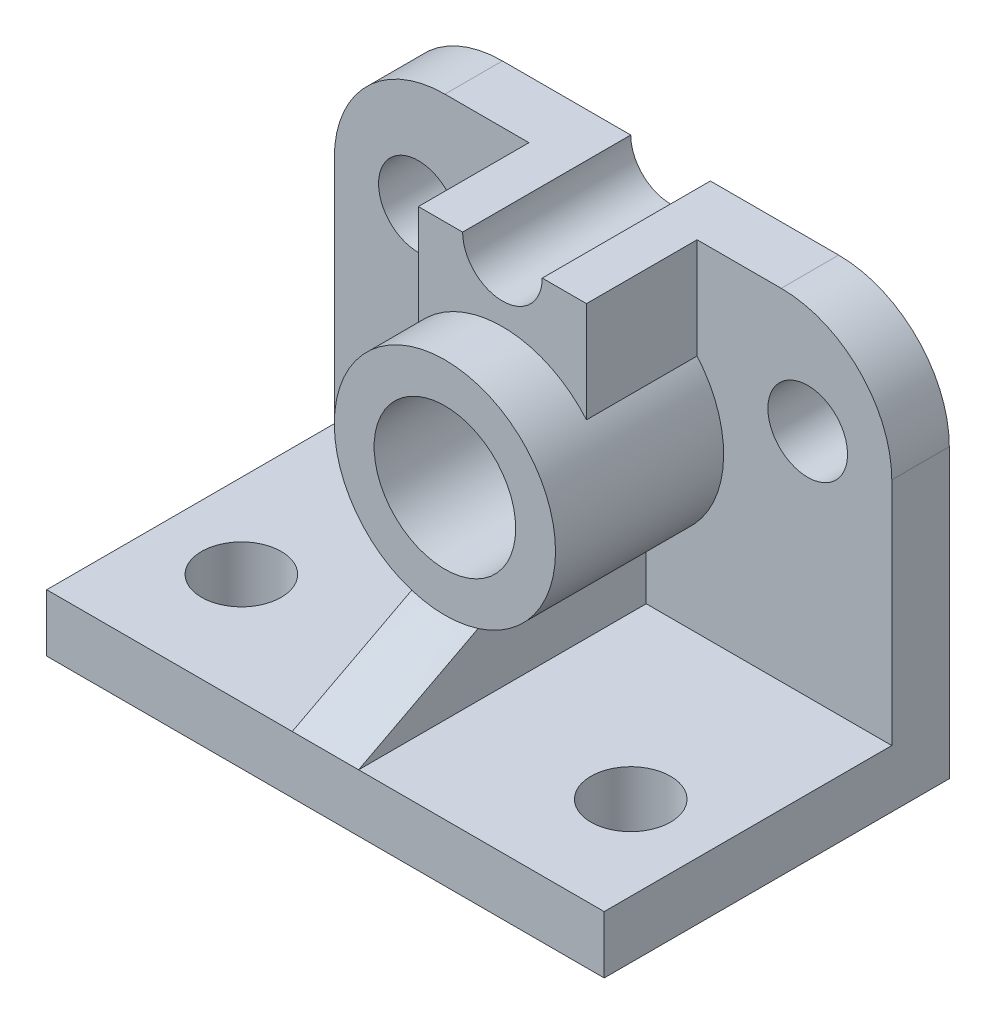
ISO-10303-21;
HEADER;
FILE_DESCRIPTION(('STEP AP214'),'2;1');
FILE_NAME('part.step','',(''),(''),'','','');
FILE_SCHEMA(('AUTOMOTIVE_DESIGN { 1 0 10303 214 1 1 1 1 }'));
ENDSEC;
DATA;
#1=APPLICATION_CONTEXT('core data for automotive mechanical design processes');
#2=APPLICATION_PROTOCOL_DEFINITION('international standard','automotive_design',2000,#1);
#3=PRODUCT_CONTEXT('',#1,'mechanical');
#4=PRODUCT('Part','Part','',(#3));
#5=PRODUCT_RELATED_PRODUCT_CATEGORY('part','',(#4));
#6=PRODUCT_DEFINITION_FORMATION('','',#4);
#7=PRODUCT_DEFINITION_CONTEXT('part definition',#1,'design');
#8=PRODUCT_DEFINITION('design','',#6,#7);
#9=PRODUCT_DEFINITION_SHAPE('','',#8);
#10=(LENGTH_UNIT() NAMED_UNIT(*) SI_UNIT(.MILLI.,.METRE.));
#11=(NAMED_UNIT(*) PLANE_ANGLE_UNIT() SI_UNIT($,.RADIAN.));
#12=(NAMED_UNIT(*) SI_UNIT($,.STERADIAN.) SOLID_ANGLE_UNIT());
#13=UNCERTAINTY_MEASURE_WITH_UNIT(LENGTH_MEASURE(1.E-05),#10,'distance_accuracy_value','');
#14=(GEOMETRIC_REPRESENTATION_CONTEXT(3) GLOBAL_UNCERTAINTY_ASSIGNED_CONTEXT((#13)) GLOBAL_UNIT_ASSIGNED_CONTEXT((#10,
#11,#12)) REPRESENTATION_CONTEXT('',''));
#15=CARTESIAN_POINT('',(0.,0.,0.));
#16=DIRECTION('',(0.,0.,1.));
#17=DIRECTION('',(1.,0.,0.));
#18=AXIS2_PLACEMENT_3D('',#15,#16,#17);
#19=CARTESIAN_POINT('',(0.,6.5,78.));
#20=DIRECTION('',(0.,1.,0.));
#21=DIRECTION('',(0.,0.,1.));
#22=AXIS2_PLACEMENT_3D('',#19,#20,#21);
#23=PLANE('',#22);
#24=CARTESIAN_POINT('',(-44.,6.5,53.));
#25=DIRECTION('',(0.,1.,0.));
#26=DIRECTION('',(0.,0.,1.));
#27=AXIS2_PLACEMENT_3D('',#24,#25,#26);
#28=CIRCLE('',#27,9.);
#29=CARTESIAN_POINT('',(-44.,6.5,62.));
#30=VERTEX_POINT('',#29);
#31=EDGE_CURVE('E309',#30,#30,#28,.T.);
#32=ORIENTED_EDGE('',*,*,#31,.F.);
#33=EDGE_LOOP('',(#32));
#34=FACE_BOUND('',#33,.T.);
#35=DIRECTION('',(1.,0.,0.));
#36=VECTOR('',#35,1.);
#37=CARTESIAN_POINT('',(0.,6.5,78.));
#38=LINE('',#37,#36);
#39=CARTESIAN_POINT('',(-63.,6.5,78.));
#40=VERTEX_POINT('',#39);
#41=CARTESIAN_POINT('',(-7.5,6.5,78.));
#42=VERTEX_POINT('',#41);
#43=EDGE_CURVE('E414',#40,#42,#38,.T.);
#44=ORIENTED_EDGE('',*,*,#43,.T.);
#45=DIRECTION('',(0.,0.,-1.));
#46=VECTOR('',#45,1.);
#47=CARTESIAN_POINT('',(-7.5,6.5,13.));
#48=LINE('',#47,#46);
#49=CARTESIAN_POINT('',(-7.5,6.5,13.));
#50=VERTEX_POINT('',#49);
#51=EDGE_CURVE('E211',#42,#50,#48,.T.);
#52=ORIENTED_EDGE('',*,*,#51,.T.);
#53=DIRECTION('',(1.,0.,0.));
#54=VECTOR('',#53,1.);
#55=CARTESIAN_POINT('',(0.,6.5,13.));
#56=LINE('',#55,#54);
#57=CARTESIAN_POINT('',(-63.,6.5,13.));
#58=VERTEX_POINT('',#57);
#59=EDGE_CURVE('E371',#58,#50,#56,.T.);
#60=ORIENTED_EDGE('',*,*,#59,.F.);
#61=DIRECTION('',(0.,0.,-1.));
#62=VECTOR('',#61,1.);
#63=CARTESIAN_POINT('',(-63.,6.5,78.));
#64=LINE('',#63,#62);
#65=EDGE_CURVE('E429',#40,#58,#64,.T.);
#66=ORIENTED_EDGE('',*,*,#65,.F.);
#67=EDGE_LOOP('',(#44,#52,#60,#66));
#68=FACE_BOUND('',#67,.T.);
#69=ADVANCED_FACE('F47',(#34,#68),#23,.T.);
#70=CARTESIAN_POINT('',(0.,0.,13.));
#71=DIRECTION('',(0.,0.,1.));
#72=DIRECTION('',(1.,0.,0.));
#73=AXIS2_PLACEMENT_3D('',#70,#71,#72);
#74=PLANE('',#73);
#75=CARTESIAN_POINT('',(-44.,58.5,13.));
#76=DIRECTION('',(0.,0.,1.));
#77=DIRECTION('',(1.,0.,0.));
#78=AXIS2_PLACEMENT_3D('',#75,#76,#77);
#79=CIRCLE('',#78,9.);
#80=CARTESIAN_POINT('',(-53.,58.5,13.));
#81=VERTEX_POINT('',#80);
#82=EDGE_CURVE('E386',#81,#81,#79,.T.);
#83=ORIENTED_EDGE('',*,*,#82,.F.);
#84=EDGE_LOOP('',(#83));
#85=FACE_BOUND('',#84,.T.);
#86=ORIENTED_EDGE('',*,*,#59,.T.);
#87=DIRECTION('',(0.,1.,0.));
#88=VECTOR('',#87,1.);
#89=CARTESIAN_POINT('',(-7.5,20.6515199645764,13.));
#90=LINE('',#89,#88);
#91=CARTESIAN_POINT('',(-7.5,20.6515199645764,13.));
#92=VERTEX_POINT('',#91);
#93=EDGE_CURVE('E199',#50,#92,#90,.T.);
#94=ORIENTED_EDGE('',*,*,#93,.T.);
#95=CARTESIAN_POINT('',(0.,44.5,13.));
#96=DIRECTION('',(0.,0.,1.));
#97=DIRECTION('',(1.,0.,0.));
#98=AXIS2_PLACEMENT_3D('',#95,#96,#97);
#99=CIRCLE('',#98,25.);
#100=CARTESIAN_POINT('',(-19.,60.7480768092719,13.));
#101=VERTEX_POINT('',#100);
#102=EDGE_CURVE('E195',#101,#92,#99,.T.);
#103=ORIENTED_EDGE('',*,*,#102,.F.);
#104=DIRECTION('',(0.,-1.,0.));
#105=VECTOR('',#104,1.);
#106=CARTESIAN_POINT('',(-19.,0.,13.));
#107=LINE('',#106,#105);
#108=CARTESIAN_POINT('',(-19.,83.5,13.));
#109=VERTEX_POINT('',#108);
#110=EDGE_CURVE('E360',#109,#101,#107,.T.);
#111=ORIENTED_EDGE('',*,*,#110,.F.);
#112=DIRECTION('',(1.,0.,0.));
#113=VECTOR('',#112,1.);
#114=CARTESIAN_POINT('',(0.,83.5,13.));
#115=LINE('',#114,#113);
#116=CARTESIAN_POINT('',(-38.,83.5,13.));
#117=VERTEX_POINT('',#116);
#118=EDGE_CURVE('E502',#117,#109,#115,.T.);
#119=ORIENTED_EDGE('',*,*,#118,.F.);
#120=CARTESIAN_POINT('',(-38.,58.5,13.));
#121=DIRECTION('',(0.,0.,1.));
#122=DIRECTION('',(1.,0.,0.));
#123=AXIS2_PLACEMENT_3D('',#120,#121,#122);
#124=CIRCLE('',#123,25.);
#125=CARTESIAN_POINT('',(-63.,58.5,13.));
#126=VERTEX_POINT('',#125);
#127=EDGE_CURVE('E460',#117,#126,#124,.T.);
#128=ORIENTED_EDGE('',*,*,#127,.T.);
#129=DIRECTION('',(0.,1.,0.));
#130=VECTOR('',#129,1.);
#131=CARTESIAN_POINT('',(-63.,0.,13.));
#132=LINE('',#131,#130);
#133=EDGE_CURVE('E372',#58,#126,#132,.T.);
#134=ORIENTED_EDGE('',*,*,#133,.F.);
#135=EDGE_LOOP('',(#86,#94,#103,#111,#119,#128,#134));
#136=FACE_BOUND('',#135,.T.);
#137=ADVANCED_FACE('F515',(#85,#136),#74,.T.);
#138=CARTESIAN_POINT('',(0.,44.5,51.));
#139=DIRECTION('',(0.,0.,-1.));
#140=DIRECTION('',(-1.,0.,0.));
#141=AXIS2_PLACEMENT_3D('',#138,#139,#140);
#142=CYLINDRICAL_SURFACE('',#141,25.);
#143=ORIENTED_EDGE('',*,*,#102,.T.);
#144=DIRECTION('',(0.,0.,1.));
#145=VECTOR('',#144,1.);
#146=CARTESIAN_POINT('',(-7.5,20.6515199645764,51.));
#147=LINE('',#146,#145);
#148=CARTESIAN_POINT('',(-7.5,20.6515199645764,51.));
#149=VERTEX_POINT('',#148);
#150=EDGE_CURVE('E192',#92,#149,#147,.T.);
#151=ORIENTED_EDGE('',*,*,#150,.T.);
#152=CARTESIAN_POINT('',(0.,44.5,51.));
#153=DIRECTION('',(0.,0.,1.));
#154=DIRECTION('',(1.,0.,0.));
#155=AXIS2_PLACEMENT_3D('',#152,#153,#154);
#156=CIRCLE('',#155,25.);
#157=CARTESIAN_POINT('',(7.5,20.6515199645764,51.));
#158=VERTEX_POINT('',#157);
#159=EDGE_CURVE('E177',#158,#149,#156,.T.);
#160=ORIENTED_EDGE('',*,*,#159,.F.);
#161=DIRECTION('',(0.,0.,1.));
#162=VECTOR('',#161,1.);
#163=CARTESIAN_POINT('',(7.5,20.6515199645764,51.));
#164=LINE('',#163,#162);
#165=CARTESIAN_POINT('',(7.5,20.6515199645764,13.));
#166=VERTEX_POINT('',#165);
#167=EDGE_CURVE('E275',#166,#158,#164,.T.);
#168=ORIENTED_EDGE('',*,*,#167,.F.);
#169=CARTESIAN_POINT('',(19.,60.7480768092719,13.));
#170=VERTEX_POINT('',#169);
#171=EDGE_CURVE('E364',#166,#170,#99,.T.);
#172=ORIENTED_EDGE('',*,*,#171,.T.);
#173=DIRECTION('',(0.,0.,-1.));
#174=VECTOR('',#173,1.);
#175=CARTESIAN_POINT('',(19.,60.7480768092719,38.));
#176=LINE('',#175,#174);
#177=CARTESIAN_POINT('',(19.,60.7480768092719,38.));
#178=VERTEX_POINT('',#177);
#179=EDGE_CURVE('E342',#178,#170,#176,.T.);
#180=ORIENTED_EDGE('',*,*,#179,.F.);
#181=CARTESIAN_POINT('',(0.,44.5,38.));
#182=DIRECTION('',(0.,0.,1.));
#183=DIRECTION('',(1.,0.,0.));
#184=AXIS2_PLACEMENT_3D('',#181,#182,#183);
#185=CIRCLE('',#184,25.);
#186=CARTESIAN_POINT('',(-19.,60.7480768092719,38.));
#187=VERTEX_POINT('',#186);
#188=EDGE_CURVE('E326',#178,#187,#185,.T.);
#189=ORIENTED_EDGE('',*,*,#188,.T.);
#190=DIRECTION('',(0.,0.,-1.));
#191=VECTOR('',#190,1.);
#192=CARTESIAN_POINT('',(-19.,60.7480768092719,38.));
#193=LINE('',#192,#191);
#194=EDGE_CURVE('E345',#187,#101,#193,.T.);
#195=ORIENTED_EDGE('',*,*,#194,.T.);
#196=EDGE_LOOP('',(#143,#151,#160,#168,#172,#180,#189,#195));
#197=FACE_BOUND('',#196,.T.);
#198=ADVANCED_FACE('F193',(#197),#142,.T.);
#199=CARTESIAN_POINT('',(63.,0.,78.));
#200=DIRECTION('',(1.,0.,0.));
#201=DIRECTION('',(0.,0.,-1.));
#202=AXIS2_PLACEMENT_3D('',#199,#200,#201);
#203=PLANE('',#202);
#204=DIRECTION('',(0.,-1.,0.));
#205=VECTOR('',#204,1.);
#206=CARTESIAN_POINT('',(63.,0.,0.));
#207=LINE('',#206,#205);
#208=CARTESIAN_POINT('',(63.,58.5,0.));
#209=VERTEX_POINT('',#208);
#210=CARTESIAN_POINT('',(63.,-6.5,0.));
#211=VERTEX_POINT('',#210);
#212=EDGE_CURVE('E392',#209,#211,#207,.T.);
#213=ORIENTED_EDGE('',*,*,#212,.F.);
#214=DIRECTION('',(0.,0.,-1.));
#215=VECTOR('',#214,1.);
#216=CARTESIAN_POINT('',(63.,58.5,78.));
#217=LINE('',#216,#215);
#218=CARTESIAN_POINT('',(63.,58.5,13.));
#219=VERTEX_POINT('',#218);
#220=EDGE_CURVE('E57',#209,#219,#217,.F.);
#221=ORIENTED_EDGE('',*,*,#220,.T.);
#222=DIRECTION('',(0.,1.,0.));
#223=VECTOR('',#222,1.);
#224=CARTESIAN_POINT('',(63.,0.,13.));
#225=LINE('',#224,#223);
#226=CARTESIAN_POINT('',(63.,6.5,13.));
#227=VERTEX_POINT('',#226);
#228=EDGE_CURVE('E376',#227,#219,#225,.T.);
#229=ORIENTED_EDGE('',*,*,#228,.F.);
#230=DIRECTION('',(0.,0.,-1.));
#231=VECTOR('',#230,1.);
#232=CARTESIAN_POINT('',(63.,6.5,78.));
#233=LINE('',#232,#231);
#234=CARTESIAN_POINT('',(63.,6.5,78.));
#235=VERTEX_POINT('',#234);
#236=EDGE_CURVE('E421',#235,#227,#233,.T.);
#237=ORIENTED_EDGE('',*,*,#236,.F.);
#238=DIRECTION('',(0.,-1.,0.));
#239=VECTOR('',#238,1.);
#240=CARTESIAN_POINT('',(63.,0.,78.));
#241=LINE('',#240,#239);
#242=CARTESIAN_POINT('',(63.,-6.5,78.));
#243=VERTEX_POINT('',#242);
#244=EDGE_CURVE('E403',#235,#243,#241,.T.);
#245=ORIENTED_EDGE('',*,*,#244,.T.);
#246=DIRECTION('',(0.,0.,-1.));
#247=VECTOR('',#246,1.);
#248=CARTESIAN_POINT('',(63.,-6.5,78.));
#249=LINE('',#248,#247);
#250=EDGE_CURVE('E438',#243,#211,#249,.T.);
#251=ORIENTED_EDGE('',*,*,#250,.T.);
#252=EDGE_LOOP('',(#213,#221,#229,#237,#245,#251));
#253=FACE_BOUND('',#252,.T.);
#254=ADVANCED_FACE('F426',(#253),#203,.T.);
#255=DIRECTION('',(0.,0.,-1.));
#256=VECTOR('',#255,1.);
#257=CARTESIAN_POINT('',(7.5,6.5,13.));
#258=LINE('',#257,#256);
#259=CARTESIAN_POINT('',(7.5,6.5,78.));
#260=VERTEX_POINT('',#259);
#261=CARTESIAN_POINT('',(7.5,6.5,13.));
#262=VERTEX_POINT('',#261);
#263=EDGE_CURVE('E64',#260,#262,#258,.T.);
#264=ORIENTED_EDGE('',*,*,#263,.F.);
#265=EDGE_CURVE('E406',#260,#235,#38,.T.);
#266=ORIENTED_EDGE('',*,*,#265,.T.);
#267=ORIENTED_EDGE('',*,*,#236,.T.);
#268=EDGE_CURVE('E368',#262,#227,#56,.T.);
#269=ORIENTED_EDGE('',*,*,#268,.F.);
#270=EDGE_LOOP('',(#264,#266,#267,#269));
#271=FACE_BOUND('',#270,.T.);
#272=CARTESIAN_POINT('',(44.,6.5,53.));
#273=DIRECTION('',(0.,1.,0.));
#274=DIRECTION('',(0.,0.,-1.));
#275=AXIS2_PLACEMENT_3D('',#272,#273,#274);
#276=CIRCLE('',#275,9.);
#277=CARTESIAN_POINT('',(44.,6.5,44.));
#278=VERTEX_POINT('',#277);
#279=EDGE_CURVE('E274',#278,#278,#276,.T.);
#280=ORIENTED_EDGE('',*,*,#279,.F.);
#281=EDGE_LOOP('',(#280));
#282=FACE_BOUND('',#281,.T.);
#283=ADVANCED_FACE('F419',(#271,#282),#23,.T.);
#284=CARTESIAN_POINT('',(-63.,0.,78.));
#285=DIRECTION('',(1.,0.,0.));
#286=DIRECTION('',(0.,0.,-1.));
#287=AXIS2_PLACEMENT_3D('',#284,#285,#286);
#288=PLANE('',#287);
#289=ORIENTED_EDGE('',*,*,#133,.T.);
#290=DIRECTION('',(0.,0.,-1.));
#291=VECTOR('',#290,1.);
#292=CARTESIAN_POINT('',(-63.,58.5,0.));
#293=LINE('',#292,#291);
#294=CARTESIAN_POINT('',(-63.,58.5,0.));
#295=VERTEX_POINT('',#294);
#296=EDGE_CURVE('E428',#126,#295,#293,.T.);
#297=ORIENTED_EDGE('',*,*,#296,.T.);
#298=DIRECTION('',(0.,-1.,0.));
#299=VECTOR('',#298,1.);
#300=CARTESIAN_POINT('',(-63.,0.,0.));
#301=LINE('',#300,#299);
#302=CARTESIAN_POINT('',(-63.,-6.5,0.));
#303=VERTEX_POINT('',#302);
#304=EDGE_CURVE('E513',#295,#303,#301,.T.);
#305=ORIENTED_EDGE('',*,*,#304,.T.);
#306=DIRECTION('',(0.,0.,-1.));
#307=VECTOR('',#306,1.);
#308=CARTESIAN_POINT('',(-63.,-6.5,78.));
#309=LINE('',#308,#307);
#310=CARTESIAN_POINT('',(-63.,-6.5,78.));
#311=VERTEX_POINT('',#310);
#312=EDGE_CURVE('E442',#311,#303,#309,.T.);
#313=ORIENTED_EDGE('',*,*,#312,.F.);
#314=DIRECTION('',(0.,-1.,0.));
#315=VECTOR('',#314,1.);
#316=CARTESIAN_POINT('',(-63.,0.,78.));
#317=LINE('',#316,#315);
#318=EDGE_CURVE('E410',#40,#311,#317,.T.);
#319=ORIENTED_EDGE('',*,*,#318,.F.);
#320=ORIENTED_EDGE('',*,*,#65,.T.);
#321=EDGE_LOOP('',(#289,#297,#305,#313,#319,#320));
#322=FACE_BOUND('',#321,.T.);
#323=ADVANCED_FACE('F508',(#322),#288,.F.);
#324=CARTESIAN_POINT('',(0.,-6.5,78.));
#325=DIRECTION('',(0.,1.,0.));
#326=DIRECTION('',(0.,0.,1.));
#327=AXIS2_PLACEMENT_3D('',#324,#325,#326);
#328=PLANE('',#327);
#329=CARTESIAN_POINT('',(-44.,-6.5,53.));
#330=DIRECTION('',(0.,1.,0.));
#331=DIRECTION('',(0.,0.,1.));
#332=AXIS2_PLACEMENT_3D('',#329,#330,#331);
#333=CIRCLE('',#332,9.);
#334=CARTESIAN_POINT('',(-44.,-6.5,62.));
#335=VERTEX_POINT('',#334);
#336=EDGE_CURVE('E300',#335,#335,#333,.T.);
#337=ORIENTED_EDGE('',*,*,#336,.T.);
#338=EDGE_LOOP('',(#337));
#339=FACE_BOUND('',#338,.T.);
#340=CARTESIAN_POINT('',(44.,-6.5,53.));
#341=DIRECTION('',(0.,1.,0.));
#342=DIRECTION('',(0.,0.,-1.));
#343=AXIS2_PLACEMENT_3D('',#340,#341,#342);
#344=CIRCLE('',#343,9.);
#345=CARTESIAN_POINT('',(44.,-6.5,44.));
#346=VERTEX_POINT('',#345);
#347=EDGE_CURVE('E312',#346,#346,#344,.T.);
#348=ORIENTED_EDGE('',*,*,#347,.T.);
#349=EDGE_LOOP('',(#348));
#350=FACE_BOUND('',#349,.T.);
#351=DIRECTION('',(1.,0.,0.));
#352=VECTOR('',#351,1.);
#353=CARTESIAN_POINT('',(0.,-6.5,0.));
#354=LINE('',#353,#352);
#355=EDGE_CURVE('E407',#303,#211,#354,.T.);
#356=ORIENTED_EDGE('',*,*,#355,.T.);
#357=ORIENTED_EDGE('',*,*,#250,.F.);
#358=DIRECTION('',(1.,0.,0.));
#359=VECTOR('',#358,1.);
#360=CARTESIAN_POINT('',(0.,-6.5,78.));
#361=LINE('',#360,#359);
#362=EDGE_CURVE('E416',#311,#243,#361,.T.);
#363=ORIENTED_EDGE('',*,*,#362,.F.);
#364=ORIENTED_EDGE('',*,*,#312,.T.);
#365=EDGE_LOOP('',(#356,#357,#363,#364));
#366=FACE_BOUND('',#365,.T.);
#367=ADVANCED_FACE('F440',(#339,#350,#366),#328,.F.);
#368=CARTESIAN_POINT('',(0.,0.,78.));
#369=DIRECTION('',(0.,0.,1.));
#370=DIRECTION('',(1.,0.,0.));
#371=AXIS2_PLACEMENT_3D('',#368,#369,#370);
#372=PLANE('',#371);
#373=ORIENTED_EDGE('',*,*,#244,.F.);
#374=ORIENTED_EDGE('',*,*,#265,.F.);
#375=DIRECTION('',(-1.,0.,0.));
#376=VECTOR('',#375,1.);
#377=CARTESIAN_POINT('',(0.,6.5,78.));
#378=LINE('',#377,#376);
#379=EDGE_CURVE('E71',#260,#42,#378,.T.);
#380=ORIENTED_EDGE('',*,*,#379,.T.);
#381=ORIENTED_EDGE('',*,*,#43,.F.);
#382=ORIENTED_EDGE('',*,*,#318,.T.);
#383=ORIENTED_EDGE('',*,*,#362,.T.);
#384=EDGE_LOOP('',(#373,#374,#380,#381,#382,#383));
#385=FACE_BOUND('',#384,.T.);
#386=ADVANCED_FACE('F431',(#385),#372,.T.);
#387=CARTESIAN_POINT('',(0.,0.,0.));
#388=DIRECTION('',(0.,0.,1.));
#389=DIRECTION('',(1.,0.,0.));
#390=AXIS2_PLACEMENT_3D('',#387,#388,#389);
#391=PLANE('',#390);
#392=ORIENTED_EDGE('',*,*,#304,.F.);
#393=CARTESIAN_POINT('',(-38.,58.5,0.));
#394=DIRECTION('',(0.,0.,1.));
#395=DIRECTION('',(1.,0.,0.));
#396=AXIS2_PLACEMENT_3D('',#393,#394,#395);
#397=CIRCLE('',#396,25.);
#398=CARTESIAN_POINT('',(-38.,83.5,0.));
#399=VERTEX_POINT('',#398);
#400=EDGE_CURVE('E454',#295,#399,#397,.F.);
#401=ORIENTED_EDGE('',*,*,#400,.T.);
#402=DIRECTION('',(1.,0.,0.));
#403=VECTOR('',#402,1.);
#404=CARTESIAN_POINT('',(0.,83.5,0.));
#405=LINE('',#404,#403);
#406=CARTESIAN_POINT('',(-9.,83.5,0.));
#407=VERTEX_POINT('',#406);
#408=EDGE_CURVE('E187',#399,#407,#405,.T.);
#409=ORIENTED_EDGE('',*,*,#408,.T.);
#410=CARTESIAN_POINT('',(0.,83.5,0.));
#411=DIRECTION('',(0.,0.,1.));
#412=DIRECTION('',(1.,0.,0.));
#413=AXIS2_PLACEMENT_3D('',#410,#411,#412);
#414=CIRCLE('',#413,9.);
#415=CARTESIAN_POINT('',(9.,83.5,0.));
#416=VERTEX_POINT('',#415);
#417=EDGE_CURVE('E308',#407,#416,#414,.T.);
#418=ORIENTED_EDGE('',*,*,#417,.T.);
#419=DIRECTION('',(1.,0.,0.));
#420=VECTOR('',#419,1.);
#421=CARTESIAN_POINT('',(0.,83.5,0.));
#422=LINE('',#421,#420);
#423=CARTESIAN_POINT('',(38.,83.5,0.));
#424=VERTEX_POINT('',#423);
#425=EDGE_CURVE('E394',#416,#424,#422,.T.);
#426=ORIENTED_EDGE('',*,*,#425,.T.);
#427=CARTESIAN_POINT('',(38.,58.5,0.));
#428=DIRECTION('',(0.,0.,1.));
#429=DIRECTION('',(1.,0.,0.));
#430=AXIS2_PLACEMENT_3D('',#427,#428,#429);
#431=CIRCLE('',#430,25.);
#432=EDGE_CURVE('E452',#424,#209,#431,.F.);
#433=ORIENTED_EDGE('',*,*,#432,.T.);
#434=ORIENTED_EDGE('',*,*,#212,.T.);
#435=ORIENTED_EDGE('',*,*,#355,.F.);
#436=EDGE_LOOP('',(#392,#401,#409,#418,#426,#433,#434,#435));
#437=FACE_BOUND('',#436,.T.);
#438=CARTESIAN_POINT('',(-44.,58.5,0.));
#439=DIRECTION('',(0.,0.,1.));
#440=DIRECTION('',(1.,0.,0.));
#441=AXIS2_PLACEMENT_3D('',#438,#439,#440);
#442=CIRCLE('',#441,9.);
#443=CARTESIAN_POINT('',(-53.,58.5,0.));
#444=VERTEX_POINT('',#443);
#445=EDGE_CURVE('E397',#444,#444,#442,.T.);
#446=ORIENTED_EDGE('',*,*,#445,.T.);
#447=EDGE_LOOP('',(#446));
#448=FACE_BOUND('',#447,.T.);
#449=CARTESIAN_POINT('',(44.,58.4999999999999,0.));
#450=DIRECTION('',(0.,0.,1.));
#451=DIRECTION('',(1.,0.,0.));
#452=AXIS2_PLACEMENT_3D('',#449,#450,#451);
#453=CIRCLE('',#452,9.);
#454=CARTESIAN_POINT('',(35.,58.4999999999999,0.));
#455=VERTEX_POINT('',#454);
#456=EDGE_CURVE('E400',#455,#455,#453,.F.);
#457=ORIENTED_EDGE('',*,*,#456,.F.);
#458=EDGE_LOOP('',(#457));
#459=FACE_BOUND('',#458,.T.);
#460=CARTESIAN_POINT('',(0.,44.5,0.));
#461=DIRECTION('',(0.,0.,1.));
#462=DIRECTION('',(1.,0.,0.));
#463=AXIS2_PLACEMENT_3D('',#460,#461,#462);
#464=CIRCLE('',#463,16.);
#465=CARTESIAN_POINT('',(16.,44.5,0.));
#466=VERTEX_POINT('',#465);
#467=EDGE_CURVE('E353',#466,#466,#464,.T.);
#468=ORIENTED_EDGE('',*,*,#467,.T.);
#469=EDGE_LOOP('',(#468));
#470=FACE_BOUND('',#469,.T.);
#471=ADVANCED_FACE('F478',(#437,#448,#459,#470),#391,.F.);
#472=CARTESIAN_POINT('',(0.,83.5,13.));
#473=DIRECTION('',(0.,1.,0.));
#474=DIRECTION('',(0.,0.,1.));
#475=AXIS2_PLACEMENT_3D('',#472,#473,#474);
#476=PLANE('',#475);
#477=ORIENTED_EDGE('',*,*,#408,.F.);
#478=DIRECTION('',(0.,0.,-1.));
#479=VECTOR('',#478,1.);
#480=CARTESIAN_POINT('',(-38.,83.5,13.));
#481=LINE('',#480,#479);
#482=EDGE_CURVE('E456',#399,#117,#481,.F.);
#483=ORIENTED_EDGE('',*,*,#482,.T.);
#484=ORIENTED_EDGE('',*,*,#118,.T.);
#485=DIRECTION('',(0.,0.,-1.));
#486=VECTOR('',#485,1.);
#487=CARTESIAN_POINT('',(-19.,83.5,38.));
#488=LINE('',#487,#486);
#489=CARTESIAN_POINT('',(-19.,83.5,38.));
#490=VERTEX_POINT('',#489);
#491=EDGE_CURVE('E347',#490,#109,#488,.T.);
#492=ORIENTED_EDGE('',*,*,#491,.F.);
#493=DIRECTION('',(1.,0.,0.));
#494=VECTOR('',#493,1.);
#495=CARTESIAN_POINT('',(0.,83.5,38.));
#496=LINE('',#495,#494);
#497=CARTESIAN_POINT('',(-9.,83.5,38.));
#498=VERTEX_POINT('',#497);
#499=EDGE_CURVE('E320',#490,#498,#496,.T.);
#500=ORIENTED_EDGE('',*,*,#499,.T.);
#501=DIRECTION('',(0.,0.,-1.));
#502=VECTOR('',#501,1.);
#503=CARTESIAN_POINT('',(-9.,83.5,38.));
#504=LINE('',#503,#502);
#505=EDGE_CURVE('E350',#498,#407,#504,.T.);
#506=ORIENTED_EDGE('',*,*,#505,.T.);
#507=EDGE_LOOP('',(#477,#483,#484,#492,#500,#506));
#508=FACE_BOUND('',#507,.T.);
#509=ADVANCED_FACE('F514',(#508),#476,.T.);
#510=CARTESIAN_POINT('',(0.,83.5,13.));
#511=DIRECTION('',(0.,1.,0.));
#512=DIRECTION('',(0.,0.,1.));
#513=AXIS2_PLACEMENT_3D('',#510,#511,#512);
#514=PLANE('',#513);
#515=DIRECTION('',(1.,0.,0.));
#516=VECTOR('',#515,1.);
#517=CARTESIAN_POINT('',(0.,83.5,13.));
#518=LINE('',#517,#516);
#519=CARTESIAN_POINT('',(19.,83.4999999999999,13.));
#520=VERTEX_POINT('',#519);
#521=CARTESIAN_POINT('',(38.,83.5,13.));
#522=VERTEX_POINT('',#521);
#523=EDGE_CURVE('E380',#520,#522,#518,.T.);
#524=ORIENTED_EDGE('',*,*,#523,.T.);
#525=DIRECTION('',(0.,0.,-1.));
#526=VECTOR('',#525,1.);
#527=CARTESIAN_POINT('',(38.,83.5,13.));
#528=LINE('',#527,#526);
#529=EDGE_CURVE('E462',#522,#424,#528,.T.);
#530=ORIENTED_EDGE('',*,*,#529,.T.);
#531=ORIENTED_EDGE('',*,*,#425,.F.);
#532=DIRECTION('',(0.,0.,-1.));
#533=VECTOR('',#532,1.);
#534=CARTESIAN_POINT('',(9.,83.5,38.));
#535=LINE('',#534,#533);
#536=CARTESIAN_POINT('',(9.,83.5,38.));
#537=VERTEX_POINT('',#536);
#538=EDGE_CURVE('E334',#537,#416,#535,.T.);
#539=ORIENTED_EDGE('',*,*,#538,.F.);
#540=DIRECTION('',(1.,0.,0.));
#541=VECTOR('',#540,1.);
#542=CARTESIAN_POINT('',(4.63518112781003E-13,83.5,38.));
#543=LINE('',#542,#541);
#544=CARTESIAN_POINT('',(19.,83.4999999999999,38.));
#545=VERTEX_POINT('',#544);
#546=EDGE_CURVE('E331',#537,#545,#543,.T.);
#547=ORIENTED_EDGE('',*,*,#546,.T.);
#548=DIRECTION('',(0.,0.,-1.));
#549=VECTOR('',#548,1.);
#550=CARTESIAN_POINT('',(19.,83.4999999999999,38.));
#551=LINE('',#550,#549);
#552=EDGE_CURVE('E339',#545,#520,#551,.T.);
#553=ORIENTED_EDGE('',*,*,#552,.T.);
#554=EDGE_LOOP('',(#524,#530,#531,#539,#547,#553));
#555=FACE_BOUND('',#554,.T.);
#556=ADVANCED_FACE('F475',(#555),#514,.T.);
#557=CARTESIAN_POINT('',(-44.,58.5,13.));
#558=DIRECTION('',(0.,0.,-1.));
#559=DIRECTION('',(-1.,0.,0.));
#560=AXIS2_PLACEMENT_3D('',#557,#558,#559);
#561=CYLINDRICAL_SURFACE('',#560,9.);
#562=CARTESIAN_POINT('',(-53.,58.5,13.));
#563=CARTESIAN_POINT('',(-53.,58.5,12.8645833333333));
#564=CARTESIAN_POINT('',(-53.,58.5,12.7291666666667));
#565=CARTESIAN_POINT('',(-53.,58.5,12.4583333333333));
#566=CARTESIAN_POINT('',(-53.,58.5,12.3229166666667));
#567=CARTESIAN_POINT('',(-53.,58.5,12.0520833333333));
#568=CARTESIAN_POINT('',(-53.,58.5,11.9166666666667));
#569=CARTESIAN_POINT('',(-53.,58.5,11.6458333333333));
#570=CARTESIAN_POINT('',(-53.,58.5,11.5104166666667));
#571=CARTESIAN_POINT('',(-53.,58.5,11.2395833333333));
#572=CARTESIAN_POINT('',(-53.,58.5,11.1041666666667));
#573=CARTESIAN_POINT('',(-53.,58.5,10.8333333333333));
#574=CARTESIAN_POINT('',(-53.,58.5,10.6979166666667));
#575=CARTESIAN_POINT('',(-53.,58.5,10.4270833333333));
#576=CARTESIAN_POINT('',(-53.,58.5,10.2916666666667));
#577=CARTESIAN_POINT('',(-53.,58.5,10.0208333333333));
#578=CARTESIAN_POINT('',(-53.,58.5,9.88541666666667));
#579=CARTESIAN_POINT('',(-53.,58.5,9.61458333333333));
#580=CARTESIAN_POINT('',(-53.,58.5,9.47916666666667));
#581=CARTESIAN_POINT('',(-53.,58.5,9.20833333333333));
#582=CARTESIAN_POINT('',(-53.,58.5,9.07291666666666));
#583=CARTESIAN_POINT('',(-53.,58.5,8.80208333333333));
#584=CARTESIAN_POINT('',(-53.,58.5,8.66666666666667));
#585=CARTESIAN_POINT('',(-53.,58.5,8.39583333333333));
#586=CARTESIAN_POINT('',(-53.,58.5,8.26041666666667));
#587=CARTESIAN_POINT('',(-53.,58.5,7.98958333333333));
#588=CARTESIAN_POINT('',(-53.,58.5,7.85416666666667));
#589=CARTESIAN_POINT('',(-53.,58.5,7.58333333333333));
#590=CARTESIAN_POINT('',(-53.,58.5,7.44791666666667));
#591=CARTESIAN_POINT('',(-53.,58.5,7.17708333333333));
#592=CARTESIAN_POINT('',(-53.,58.5,7.04166666666667));
#593=CARTESIAN_POINT('',(-53.,58.5,6.77083333333333));
#594=CARTESIAN_POINT('',(-53.,58.5,6.63541666666667));
#595=CARTESIAN_POINT('',(-53.,58.5,6.36458333333333));
#596=CARTESIAN_POINT('',(-53.,58.5,6.22916666666667));
#597=CARTESIAN_POINT('',(-53.,58.5,5.95833333333333));
#598=CARTESIAN_POINT('',(-53.,58.5,5.82291666666667));
#599=CARTESIAN_POINT('',(-53.,58.5,5.55208333333333));
#600=CARTESIAN_POINT('',(-53.,58.5,5.41666666666667));
#601=CARTESIAN_POINT('',(-53.,58.5,5.14583333333333));
#602=CARTESIAN_POINT('',(-53.,58.5,5.01041666666667));
#603=CARTESIAN_POINT('',(-53.,58.5,4.73958333333333));
#604=CARTESIAN_POINT('',(-53.,58.5,4.60416666666667));
#605=CARTESIAN_POINT('',(-53.,58.5,4.33333333333333));
#606=CARTESIAN_POINT('',(-53.,58.5,4.19791666666667));
#607=CARTESIAN_POINT('',(-53.,58.5,3.92708333333333));
#608=CARTESIAN_POINT('',(-53.,58.5,3.79166666666667));
#609=CARTESIAN_POINT('',(-53.,58.5,3.52083333333333));
#610=CARTESIAN_POINT('',(-53.,58.5,3.38541666666667));
#611=CARTESIAN_POINT('',(-53.,58.5,3.11458333333333));
#612=CARTESIAN_POINT('',(-53.,58.5,2.97916666666667));
#613=CARTESIAN_POINT('',(-53.,58.5,2.70833333333333));
#614=CARTESIAN_POINT('',(-53.,58.5,2.57291666666667));
#615=CARTESIAN_POINT('',(-53.,58.5,2.30208333333333));
#616=CARTESIAN_POINT('',(-53.,58.5,2.16666666666667));
#617=CARTESIAN_POINT('',(-53.,58.5,1.89583333333333));
#618=CARTESIAN_POINT('',(-53.,58.5,1.76041666666667));
#619=CARTESIAN_POINT('',(-53.,58.5,1.48958333333333));
#620=CARTESIAN_POINT('',(-53.,58.5,1.35416666666667));
#621=CARTESIAN_POINT('',(-53.,58.5,1.08333333333333));
#622=CARTESIAN_POINT('',(-53.,58.5,0.947916666666667));
#623=CARTESIAN_POINT('',(-53.,58.5,0.677083333333334));
#624=CARTESIAN_POINT('',(-53.,58.5,0.541666666666667));
#625=CARTESIAN_POINT('',(-53.,58.5,0.270833333333334));
#626=CARTESIAN_POINT('',(-53.,58.5,0.135416666666667));
#627=CARTESIAN_POINT('',(-53.,58.5,0.));
#628=B_SPLINE_CURVE_WITH_KNOTS('',3,(#562,#563,#564,#565,#566,#567,#568,#569,#570,#571,#572,
#573,#574,#575,#576,#577,#578,#579,#580,#581,#582,#583,#584,#585,#586,#587,#588,#589,#590,#591,
#592,#593,#594,#595,#596,#597,#598,#599,#600,#601,#602,#603,#604,#605,#606,#607,#608,#609,#610,
#611,#612,#613,#614,#615,#616,#617,#618,#619,#620,#621,#622,#623,#624,#625,#626,#627),
.UNSPECIFIED.,.F.,.F.,(4,2,2,2,2,2,2,2,2,2,2,2,2,2,2,2,2,2,2,2,2,2,2,2,2,2,2,2,2,2,2,2,4),(0.,
0.40625,0.812500000000001,1.21875,1.625,2.03125,2.4375,2.84375,3.25,3.65625,4.0625,4.46875,
4.875,5.28125,5.6875,6.09375,6.5,6.90625,7.3125,7.71875,8.125,8.53125,8.9375,9.34375,9.75,
10.15625,10.5625,10.96875,11.375,11.78125,12.1875,12.59375,13.),.UNSPECIFIED.);
#629=EDGE_CURVE('BSEAM537',#81,#444,#628,.T.);
#630=ORIENTED_EDGE('',*,*,#82,.T.);
#631=ORIENTED_EDGE('',*,*,#445,.F.);
#632=ORIENTED_EDGE('',*,*,#629,.T.);
#633=ORIENTED_EDGE('',*,*,#629,.F.);
#634=EDGE_LOOP('',(#630,#632,#631,#633));
#635=FACE_BOUND('',#634,.T.);
#636=ADVANCED_FACE('F537',(#635),#561,.F.);
#637=CARTESIAN_POINT('',(44.,58.4999999999999,13.));
#638=DIRECTION('',(0.,0.,-1.));
#639=DIRECTION('',(-1.,0.,0.));
#640=AXIS2_PLACEMENT_3D('',#637,#638,#639);
#641=CYLINDRICAL_SURFACE('',#640,9.);
#642=CARTESIAN_POINT('',(44.,58.4999999999999,13.));
#643=DIRECTION('',(0.,0.,1.));
#644=DIRECTION('',(1.,0.,0.));
#645=AXIS2_PLACEMENT_3D('',#642,#643,#644);
#646=CIRCLE('',#645,9.);
#647=CARTESIAN_POINT('',(35.,58.4999999999999,13.));
#648=VERTEX_POINT('',#647);
#649=EDGE_CURVE('E389',#648,#648,#646,.F.);
#650=CARTESIAN_POINT('',(35.,58.4999999999999,13.));
#651=CARTESIAN_POINT('',(35.,58.4999999999999,12.8645833333333));
#652=CARTESIAN_POINT('',(35.,58.4999999999999,12.7291666666667));
#653=CARTESIAN_POINT('',(35.,58.4999999999999,12.4583333333333));
#654=CARTESIAN_POINT('',(35.,58.4999999999999,12.3229166666667));
#655=CARTESIAN_POINT('',(35.,58.4999999999999,12.0520833333333));
#656=CARTESIAN_POINT('',(35.,58.4999999999999,11.9166666666667));
#657=CARTESIAN_POINT('',(35.,58.4999999999999,11.6458333333333));
#658=CARTESIAN_POINT('',(35.,58.4999999999999,11.5104166666667));
#659=CARTESIAN_POINT('',(35.,58.4999999999999,11.2395833333333));
#660=CARTESIAN_POINT('',(35.,58.4999999999999,11.1041666666667));
#661=CARTESIAN_POINT('',(35.,58.4999999999999,10.8333333333333));
#662=CARTESIAN_POINT('',(35.,58.4999999999999,10.6979166666667));
#663=CARTESIAN_POINT('',(35.,58.4999999999999,10.4270833333333));
#664=CARTESIAN_POINT('',(35.,58.4999999999999,10.2916666666667));
#665=CARTESIAN_POINT('',(35.,58.4999999999999,10.0208333333333));
#666=CARTESIAN_POINT('',(35.,58.4999999999999,9.88541666666667));
#667=CARTESIAN_POINT('',(35.,58.4999999999999,9.61458333333333));
#668=CARTESIAN_POINT('',(35.,58.4999999999999,9.47916666666667));
#669=CARTESIAN_POINT('',(35.,58.4999999999999,9.20833333333333));
#670=CARTESIAN_POINT('',(35.,58.4999999999999,9.07291666666666));
#671=CARTESIAN_POINT('',(35.,58.4999999999999,8.80208333333333));
#672=CARTESIAN_POINT('',(35.,58.4999999999999,8.66666666666667));
#673=CARTESIAN_POINT('',(35.,58.4999999999999,8.39583333333333));
#674=CARTESIAN_POINT('',(35.,58.4999999999999,8.26041666666667));
#675=CARTESIAN_POINT('',(35.,58.4999999999999,7.98958333333333));
#676=CARTESIAN_POINT('',(35.,58.4999999999999,7.85416666666667));
#677=CARTESIAN_POINT('',(35.,58.4999999999999,7.58333333333333));
#678=CARTESIAN_POINT('',(35.,58.4999999999999,7.44791666666667));
#679=CARTESIAN_POINT('',(35.,58.4999999999999,7.17708333333333));
#680=CARTESIAN_POINT('',(35.,58.4999999999999,7.04166666666667));
#681=CARTESIAN_POINT('',(35.,58.4999999999999,6.77083333333333));
#682=CARTESIAN_POINT('',(35.,58.4999999999999,6.63541666666667));
#683=CARTESIAN_POINT('',(35.,58.4999999999999,6.36458333333333));
#684=CARTESIAN_POINT('',(35.,58.4999999999999,6.22916666666667));
#685=CARTESIAN_POINT('',(35.,58.4999999999999,5.95833333333333));
#686=CARTESIAN_POINT('',(35.,58.4999999999999,5.82291666666667));
#687=CARTESIAN_POINT('',(35.,58.4999999999999,5.55208333333333));
#688=CARTESIAN_POINT('',(35.,58.4999999999999,5.41666666666667));
#689=CARTESIAN_POINT('',(35.,58.4999999999999,5.14583333333333));
#690=CARTESIAN_POINT('',(35.,58.4999999999999,5.01041666666667));
#691=CARTESIAN_POINT('',(35.,58.4999999999999,4.73958333333333));
#692=CARTESIAN_POINT('',(35.,58.4999999999999,4.60416666666667));
#693=CARTESIAN_POINT('',(35.,58.4999999999999,4.33333333333333));
#694=CARTESIAN_POINT('',(35.,58.4999999999999,4.19791666666667));
#695=CARTESIAN_POINT('',(35.,58.4999999999999,3.92708333333333));
#696=CARTESIAN_POINT('',(35.,58.4999999999999,3.79166666666667));
#697=CARTESIAN_POINT('',(35.,58.4999999999999,3.52083333333333));
#698=CARTESIAN_POINT('',(35.,58.4999999999999,3.38541666666667));
#699=CARTESIAN_POINT('',(35.,58.4999999999999,3.11458333333333));
#700=CARTESIAN_POINT('',(35.,58.4999999999999,2.97916666666667));
#701=CARTESIAN_POINT('',(35.,58.4999999999999,2.70833333333333));
#702=CARTESIAN_POINT('',(35.,58.4999999999999,2.57291666666667));
#703=CARTESIAN_POINT('',(35.,58.4999999999999,2.30208333333333));
#704=CARTESIAN_POINT('',(35.,58.4999999999999,2.16666666666667));
#705=CARTESIAN_POINT('',(35.,58.4999999999999,1.89583333333333));
#706=CARTESIAN_POINT('',(35.,58.4999999999999,1.76041666666667));
#707=CARTESIAN_POINT('',(35.,58.4999999999999,1.48958333333333));
#708=CARTESIAN_POINT('',(35.,58.4999999999999,1.35416666666667));
#709=CARTESIAN_POINT('',(35.,58.4999999999999,1.08333333333333));
#710=CARTESIAN_POINT('',(35.,58.4999999999999,0.947916666666667));
#711=CARTESIAN_POINT('',(35.,58.4999999999999,0.677083333333334));
#712=CARTESIAN_POINT('',(35.,58.4999999999999,0.541666666666667));
#713=CARTESIAN_POINT('',(35.,58.4999999999999,0.270833333333334));
#714=CARTESIAN_POINT('',(35.,58.4999999999999,0.135416666666667));
#715=CARTESIAN_POINT('',(35.,58.4999999999999,0.));
#716=B_SPLINE_CURVE_WITH_KNOTS('',3,(#650,#651,#652,#653,#654,#655,#656,#657,#658,#659,#660,
#661,#662,#663,#664,#665,#666,#667,#668,#669,#670,#671,#672,#673,#674,#675,#676,#677,#678,#679,
#680,#681,#682,#683,#684,#685,#686,#687,#688,#689,#690,#691,#692,#693,#694,#695,#696,#697,#698,
#699,#700,#701,#702,#703,#704,#705,#706,#707,#708,#709,#710,#711,#712,#713,#714,#715),
.UNSPECIFIED.,.F.,.F.,(4,2,2,2,2,2,2,2,2,2,2,2,2,2,2,2,2,2,2,2,2,2,2,2,2,2,2,2,2,2,2,2,4),(0.,
0.40625,0.812500000000001,1.21875,1.625,2.03125,2.4375,2.84375,3.25,3.65625,4.0625,4.46875,
4.875,5.28125,5.6875,6.09375,6.5,6.90625,7.3125,7.71875,8.125,8.53125,8.9375,9.34375,9.75,
10.15625,10.5625,10.96875,11.375,11.78125,12.1875,12.59375,13.),.UNSPECIFIED.);
#717=EDGE_CURVE('BSEAM531',#648,#455,#716,.T.);
#718=ORIENTED_EDGE('',*,*,#649,.F.);
#719=ORIENTED_EDGE('',*,*,#456,.T.);
#720=ORIENTED_EDGE('',*,*,#717,.T.);
#721=ORIENTED_EDGE('',*,*,#717,.F.);
#722=EDGE_LOOP('',(#718,#720,#719,#721));
#723=FACE_BOUND('',#722,.T.);
#724=ADVANCED_FACE('F531',(#723),#641,.F.);
#725=DIRECTION('',(0.,1.,0.));
#726=VECTOR('',#725,1.);
#727=CARTESIAN_POINT('',(7.5,20.6515199645764,13.));
#728=LINE('',#727,#726);
#729=EDGE_CURVE('E271',#262,#166,#728,.T.);
#730=ORIENTED_EDGE('',*,*,#729,.F.);
#731=ORIENTED_EDGE('',*,*,#268,.T.);
#732=ORIENTED_EDGE('',*,*,#228,.T.);
#733=CARTESIAN_POINT('',(38.,58.5,13.));
#734=DIRECTION('',(0.,0.,1.));
#735=DIRECTION('',(1.,0.,0.));
#736=AXIS2_PLACEMENT_3D('',#733,#734,#735);
#737=CIRCLE('',#736,25.);
#738=EDGE_CURVE('E458',#219,#522,#737,.T.);
#739=ORIENTED_EDGE('',*,*,#738,.T.);
#740=ORIENTED_EDGE('',*,*,#523,.F.);
#741=DIRECTION('',(0.,-1.,0.));
#742=VECTOR('',#741,1.);
#743=CARTESIAN_POINT('',(19.,0.,13.));
#744=LINE('',#743,#742);
#745=EDGE_CURVE('E383',#520,#170,#744,.T.);
#746=ORIENTED_EDGE('',*,*,#745,.T.);
#747=ORIENTED_EDGE('',*,*,#171,.F.);
#748=EDGE_LOOP('',(#730,#731,#732,#739,#740,#746,#747));
#749=FACE_BOUND('',#748,.T.);
#750=ORIENTED_EDGE('',*,*,#649,.T.);
#751=EDGE_LOOP('',(#750));
#752=FACE_BOUND('',#751,.T.);
#753=ADVANCED_FACE('F471',(#749,#752),#74,.T.);
#754=CARTESIAN_POINT('',(0.,44.5,51.));
#755=DIRECTION('',(0.,0.,-1.));
#756=DIRECTION('',(-1.,0.,0.));
#757=AXIS2_PLACEMENT_3D('',#754,#755,#756);
#758=CYLINDRICAL_SURFACE('',#757,16.);
#759=CARTESIAN_POINT('',(0.,44.5,51.));
#760=DIRECTION('',(0.,0.,1.));
#761=DIRECTION('',(1.,0.,0.));
#762=AXIS2_PLACEMENT_3D('',#759,#760,#761);
#763=CIRCLE('',#762,16.);
#764=CARTESIAN_POINT('',(16.,44.5,51.));
#765=VERTEX_POINT('',#764);
#766=EDGE_CURVE('E188',#765,#765,#763,.T.);
#767=ORIENTED_EDGE('',*,*,#766,.T.);
#768=EDGE_LOOP('',(#767));
#769=FACE_BOUND('',#768,.T.);
#770=ORIENTED_EDGE('',*,*,#467,.F.);
#771=EDGE_LOOP('',(#770));
#772=FACE_BOUND('',#771,.T.);
#773=ADVANCED_FACE('F530',(#769,#772),#758,.F.);
#774=CARTESIAN_POINT('',(0.,0.,51.));
#775=DIRECTION('',(0.,0.,1.));
#776=DIRECTION('',(1.,0.,0.));
#777=AXIS2_PLACEMENT_3D('',#774,#775,#776);
#778=PLANE('',#777);
#779=CARTESIAN_POINT('',(7.5,20.6515199645764,51.));
#780=CARTESIAN_POINT('',(5.,19.8838399881921,51.));
#781=CARTESIAN_POINT('',(0.,19.1161600118079,51.));
#782=CARTESIAN_POINT('',(-5.,19.8838399881921,51.));
#783=CARTESIAN_POINT('',(-7.5,20.6515199645764,51.));
#784=B_SPLINE_CURVE_WITH_KNOTS('',3,(#779,#780,#781,#782,#783),.UNSPECIFIED.,.F.,.F.,(4,1,4),
(0.,0.5,1.),.UNSPECIFIED.);
#785=CARTESIAN_POINT('',(2.18930776285653E-13,19.5,51.));
#786=VERTEX_POINT('',#785);
#787=EDGE_CURVE('E12',#786,#158,#784,.F.);
#788=ORIENTED_EDGE('',*,*,#787,.T.);
#789=ORIENTED_EDGE('',*,*,#159,.T.);
#790=CARTESIAN_POINT('',(-7.5,20.6515199645764,51.));
#791=CARTESIAN_POINT('',(-5.,19.8838399881921,51.));
#792=CARTESIAN_POINT('',(0.,19.1161600118079,51.));
#793=CARTESIAN_POINT('',(5.,19.8838399881921,51.));
#794=CARTESIAN_POINT('',(7.5,20.6515199645764,51.));
#795=B_SPLINE_CURVE_WITH_KNOTS('',3,(#790,#791,#792,#793,#794),.UNSPECIFIED.,.F.,.F.,(4,1,4),
(0.,0.5,1.),.UNSPECIFIED.);
#796=EDGE_CURVE('E182',#149,#786,#795,.T.);
#797=ORIENTED_EDGE('',*,*,#796,.T.);
#798=EDGE_LOOP('',(#788,#789,#797));
#799=FACE_BOUND('',#798,.T.);
#800=ORIENTED_EDGE('',*,*,#766,.F.);
#801=EDGE_LOOP('',(#800));
#802=FACE_BOUND('',#801,.T.);
#803=ADVANCED_FACE('F179',(#799,#802),#778,.T.);
#804=CARTESIAN_POINT('',(0.,83.5,38.));
#805=DIRECTION('',(0.,0.,-1.));
#806=DIRECTION('',(-1.,0.,0.));
#807=AXIS2_PLACEMENT_3D('',#804,#805,#806);
#808=CYLINDRICAL_SURFACE('',#807,9.);
#809=ORIENTED_EDGE('',*,*,#417,.F.);
#810=ORIENTED_EDGE('',*,*,#505,.F.);
#811=CARTESIAN_POINT('',(0.,83.5,38.));
#812=DIRECTION('',(0.,0.,1.));
#813=DIRECTION('',(1.,0.,0.));
#814=AXIS2_PLACEMENT_3D('',#811,#812,#813);
#815=CIRCLE('',#814,9.);
#816=EDGE_CURVE('E317',#498,#537,#815,.T.);
#817=ORIENTED_EDGE('',*,*,#816,.T.);
#818=ORIENTED_EDGE('',*,*,#538,.T.);
#819=EDGE_LOOP('',(#809,#810,#817,#818));
#820=FACE_BOUND('',#819,.T.);
#821=ADVANCED_FACE('F483',(#820),#808,.F.);
#822=CARTESIAN_POINT('',(-19.,0.,38.));
#823=DIRECTION('',(1.,0.,0.));
#824=DIRECTION('',(0.,0.,-1.));
#825=AXIS2_PLACEMENT_3D('',#822,#823,#824);
#826=PLANE('',#825);
#827=ORIENTED_EDGE('',*,*,#110,.T.);
#828=ORIENTED_EDGE('',*,*,#194,.F.);
#829=DIRECTION('',(0.,-1.,0.));
#830=VECTOR('',#829,1.);
#831=CARTESIAN_POINT('',(-19.,0.,38.));
#832=LINE('',#831,#830);
#833=EDGE_CURVE('E323',#490,#187,#832,.T.);
#834=ORIENTED_EDGE('',*,*,#833,.F.);
#835=ORIENTED_EDGE('',*,*,#491,.T.);
#836=EDGE_LOOP('',(#827,#828,#834,#835));
#837=FACE_BOUND('',#836,.T.);
#838=ADVANCED_FACE('F499',(#837),#826,.F.);
#839=CARTESIAN_POINT('',(19.,0.,38.));
#840=DIRECTION('',(1.,0.,0.));
#841=DIRECTION('',(0.,0.,-1.));
#842=AXIS2_PLACEMENT_3D('',#839,#840,#841);
#843=PLANE('',#842);
#844=ORIENTED_EDGE('',*,*,#179,.T.);
#845=ORIENTED_EDGE('',*,*,#745,.F.);
#846=ORIENTED_EDGE('',*,*,#552,.F.);
#847=DIRECTION('',(0.,-1.,0.));
#848=VECTOR('',#847,1.);
#849=CARTESIAN_POINT('',(19.,0.,38.));
#850=LINE('',#849,#848);
#851=EDGE_CURVE('E328',#545,#178,#850,.T.);
#852=ORIENTED_EDGE('',*,*,#851,.T.);
#853=EDGE_LOOP('',(#844,#845,#846,#852));
#854=FACE_BOUND('',#853,.T.);
#855=ADVANCED_FACE('F492',(#854),#843,.T.);
#856=CARTESIAN_POINT('',(0.,0.,38.));
#857=DIRECTION('',(0.,0.,1.));
#858=DIRECTION('',(1.,0.,0.));
#859=AXIS2_PLACEMENT_3D('',#856,#857,#858);
#860=PLANE('',#859);
#861=ORIENTED_EDGE('',*,*,#816,.F.);
#862=ORIENTED_EDGE('',*,*,#499,.F.);
#863=ORIENTED_EDGE('',*,*,#833,.T.);
#864=ORIENTED_EDGE('',*,*,#188,.F.);
#865=ORIENTED_EDGE('',*,*,#851,.F.);
#866=ORIENTED_EDGE('',*,*,#546,.F.);
#867=EDGE_LOOP('',(#861,#862,#863,#864,#865,#866));
#868=FACE_BOUND('',#867,.T.);
#869=ADVANCED_FACE('F488',(#868),#860,.T.);
#870=CARTESIAN_POINT('',(44.,-6.5,53.));
#871=DIRECTION('',(0.,1.,0.));
#872=DIRECTION('',(0.,0.,1.));
#873=AXIS2_PLACEMENT_3D('',#870,#871,#872);
#874=CYLINDRICAL_SURFACE('',#873,9.);
#875=ORIENTED_EDGE('',*,*,#347,.F.);
#876=EDGE_LOOP('',(#875));
#877=FACE_BOUND('',#876,.T.);
#878=ORIENTED_EDGE('',*,*,#279,.T.);
#879=EDGE_LOOP('',(#878));
#880=FACE_BOUND('',#879,.T.);
#881=ADVANCED_FACE('F568',(#877,#880),#874,.F.);
#882=CARTESIAN_POINT('',(-44.,-6.5,53.));
#883=DIRECTION('',(0.,1.,0.));
#884=DIRECTION('',(0.,0.,1.));
#885=AXIS2_PLACEMENT_3D('',#882,#883,#884);
#886=CYLINDRICAL_SURFACE('',#885,9.);
#887=ORIENTED_EDGE('',*,*,#336,.F.);
#888=EDGE_LOOP('',(#887));
#889=FACE_BOUND('',#888,.T.);
#890=ORIENTED_EDGE('',*,*,#31,.T.);
#891=EDGE_LOOP('',(#890));
#892=FACE_BOUND('',#891,.T.);
#893=ADVANCED_FACE('F563',(#889,#892),#886,.F.);
#894=CARTESIAN_POINT('',(-38.,58.5,78.));
#895=DIRECTION('',(0.,0.,1.));
#896=DIRECTION('',(1.,0.,0.));
#897=AXIS2_PLACEMENT_3D('',#894,#895,#896);
#898=CYLINDRICAL_SURFACE('',#897,25.);
#899=ORIENTED_EDGE('',*,*,#127,.F.);
#900=ORIENTED_EDGE('',*,*,#482,.F.);
#901=ORIENTED_EDGE('',*,*,#400,.F.);
#902=ORIENTED_EDGE('',*,*,#296,.F.);
#903=EDGE_LOOP('',(#899,#900,#901,#902));
#904=FACE_BOUND('',#903,.T.);
#905=ADVANCED_FACE('F511',(#904),#898,.T.);
#906=CARTESIAN_POINT('',(38.,58.5,13.));
#907=DIRECTION('',(0.,0.,-1.));
#908=DIRECTION('',(-1.,0.,0.));
#909=AXIS2_PLACEMENT_3D('',#906,#907,#908);
#910=CYLINDRICAL_SURFACE('',#909,25.);
#911=ORIENTED_EDGE('',*,*,#738,.F.);
#912=ORIENTED_EDGE('',*,*,#220,.F.);
#913=ORIENTED_EDGE('',*,*,#432,.F.);
#914=ORIENTED_EDGE('',*,*,#529,.F.);
#915=EDGE_LOOP('',(#911,#912,#913,#914));
#916=FACE_BOUND('',#915,.T.);
#917=ADVANCED_FACE('F49',(#916),#910,.T.);
#918=CARTESIAN_POINT('',(7.5,0.,0.));
#919=DIRECTION('',(1.,0.,0.));
#920=DIRECTION('',(0.,0.,-1.));
#921=AXIS2_PLACEMENT_3D('',#918,#919,#920);
#922=PLANE('',#921);
#923=ORIENTED_EDGE('',*,*,#263,.T.);
#924=ORIENTED_EDGE('',*,*,#729,.T.);
#925=ORIENTED_EDGE('',*,*,#167,.T.);
#926=DIRECTION('',(0.,-0.464229973230139,0.885714701218595));
#927=VECTOR('',#926,1.);
#928=CARTESIAN_POINT('',(7.5,6.5,78.));
#929=LINE('',#928,#927);
#930=EDGE_CURVE('E259',#158,#260,#929,.T.);
#931=ORIENTED_EDGE('',*,*,#930,.T.);
#932=EDGE_LOOP('',(#923,#924,#925,#931));
#933=FACE_BOUND('',#932,.T.);
#934=ADVANCED_FACE('F229',(#933),#922,.T.);
#935=CARTESIAN_POINT('',(-7.5,0.,0.));
#936=DIRECTION('',(1.,0.,0.));
#937=DIRECTION('',(0.,0.,-1.));
#938=AXIS2_PLACEMENT_3D('',#935,#936,#937);
#939=PLANE('',#938);
#940=ORIENTED_EDGE('',*,*,#51,.F.);
#941=DIRECTION('',(0.,-0.464229973230139,0.885714701218595));
#942=VECTOR('',#941,1.);
#943=CARTESIAN_POINT('',(-7.5,6.5,78.));
#944=LINE('',#943,#942);
#945=EDGE_CURVE('E51',#149,#42,#944,.T.);
#946=ORIENTED_EDGE('',*,*,#945,.F.);
#947=ORIENTED_EDGE('',*,*,#150,.F.);
#948=ORIENTED_EDGE('',*,*,#93,.F.);
#949=EDGE_LOOP('',(#940,#946,#947,#948));
#950=FACE_BOUND('',#949,.T.);
#951=ADVANCED_FACE('F210',(#950),#939,.F.);
#952=CARTESIAN_POINT('',(-7.5,20.6515199645764,51.));
#953=CARTESIAN_POINT('',(-5.,19.8838399881921,51.));
#954=CARTESIAN_POINT('',(0.,19.1161600118079,51.));
#955=CARTESIAN_POINT('',(5.,19.8838399881921,51.));
#956=CARTESIAN_POINT('',(7.5,20.6515199645764,51.));
#957=CARTESIAN_POINT('',(-7.5,15.9343466430509,60.));
#958=CARTESIAN_POINT('',(-5.,15.4225599921281,60.));
#959=CARTESIAN_POINT('',(0.,14.9107733412053,60.));
#960=CARTESIAN_POINT('',(5.,15.4225599921281,60.));
#961=CARTESIAN_POINT('',(7.5,15.9343466430509,60.));
#962=CARTESIAN_POINT('',(-7.5,11.2171733215255,69.));
#963=CARTESIAN_POINT('',(-5.,10.961279996064,69.));
#964=CARTESIAN_POINT('',(0.,10.7053866706026,69.));
#965=CARTESIAN_POINT('',(5.,10.961279996064,69.));
#966=CARTESIAN_POINT('',(7.5,11.2171733215255,69.));
#967=CARTESIAN_POINT('',(-7.5,6.5,78.));
#968=CARTESIAN_POINT('',(-5.,6.5,78.));
#969=CARTESIAN_POINT('',(0.,6.5,78.));
#970=CARTESIAN_POINT('',(5.,6.5,78.));
#971=CARTESIAN_POINT('',(7.5,6.5,78.));
#972=B_SPLINE_SURFACE_WITH_KNOTS('',3,3,((#952,#953,#954,#955,#956),(#957,#958,#959,#960,#961),
(#962,#963,#964,#965,#966),(#967,#968,#969,#970,#971)),.UNSPECIFIED.,.F.,.F.,.F.,(4,4),(4,1,4),
(0.,1.),(0.,0.5,1.),.UNSPECIFIED.);
#973=ORIENTED_EDGE('',*,*,#945,.T.);
#974=ORIENTED_EDGE('',*,*,#379,.F.);
#975=ORIENTED_EDGE('',*,*,#930,.F.);
#976=ORIENTED_EDGE('',*,*,#787,.F.);
#977=ORIENTED_EDGE('',*,*,#796,.F.);
#978=EDGE_LOOP('',(#973,#974,#975,#976,#977));
#979=FACE_BOUND('',#978,.T.);
#980=ADVANCED_FACE('F203',(#979),#972,.T.);
#981=CLOSED_SHELL('',(#69,#137,#198,#254,#283,#323,#367,#386,#471,#509,#556,#636,#724,#753,#773,
#803,#821,#838,#855,#869,#881,#893,#905,#917,#934,#951,#980));
#982=MANIFOLD_SOLID_BREP('B2',#981);
#983=ADVANCED_BREP_SHAPE_REPRESENTATION('',(#18,#982),#14);
#984=SHAPE_DEFINITION_REPRESENTATION(#9,#983);
ENDSEC;
END-ISO-10303-21;
